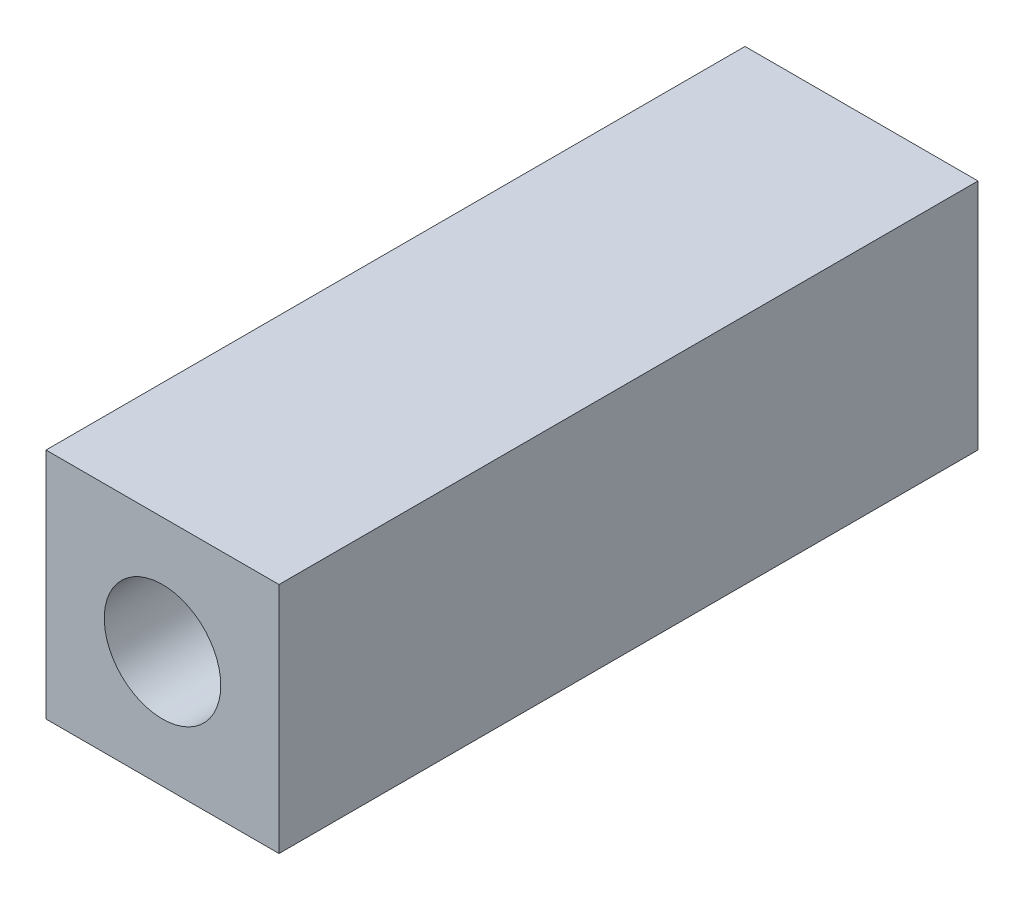
ISO-10303-21;
HEADER;
FILE_DESCRIPTION(('STEP AP214'),'2;1');
FILE_NAME('part.step','',(''),(''),'','','');
FILE_SCHEMA(('AUTOMOTIVE_DESIGN { 1 0 10303 214 1 1 1 1 }'));
ENDSEC;
DATA;
#1=APPLICATION_CONTEXT('core data for automotive mechanical design processes');
#2=APPLICATION_PROTOCOL_DEFINITION('international standard','automotive_design',2000,#1);
#3=PRODUCT_CONTEXT('',#1,'mechanical');
#4=PRODUCT('Part','Part','',(#3));
#5=PRODUCT_RELATED_PRODUCT_CATEGORY('part','',(#4));
#6=PRODUCT_DEFINITION_FORMATION('','',#4);
#7=PRODUCT_DEFINITION_CONTEXT('part definition',#1,'design');
#8=PRODUCT_DEFINITION('design','',#6,#7);
#9=PRODUCT_DEFINITION_SHAPE('','',#8);
#10=(LENGTH_UNIT() NAMED_UNIT(*) SI_UNIT(.MILLI.,.METRE.));
#11=(NAMED_UNIT(*) PLANE_ANGLE_UNIT() SI_UNIT($,.RADIAN.));
#12=(NAMED_UNIT(*) SI_UNIT($,.STERADIAN.) SOLID_ANGLE_UNIT());
#13=UNCERTAINTY_MEASURE_WITH_UNIT(LENGTH_MEASURE(1.E-05),#10,'distance_accuracy_value','');
#14=(GEOMETRIC_REPRESENTATION_CONTEXT(3) GLOBAL_UNCERTAINTY_ASSIGNED_CONTEXT((#13)) GLOBAL_UNIT_ASSIGNED_CONTEXT((#10,
#11,#12)) REPRESENTATION_CONTEXT('',''));
#15=CARTESIAN_POINT('',(0.,0.,0.));
#16=DIRECTION('',(0.,0.,1.));
#17=DIRECTION('',(1.,0.,0.));
#18=AXIS2_PLACEMENT_3D('',#15,#16,#17);
#19=CARTESIAN_POINT('',(0.,0.,30.));
#20=DIRECTION('',(0.,0.,-1.));
#21=DIRECTION('',(-1.,0.,0.));
#22=AXIS2_PLACEMENT_3D('',#19,#20,#21);
#23=PLANE('',#22);
#24=DIRECTION('',(0.,1.,0.));
#25=VECTOR('',#24,1.);
#26=CARTESIAN_POINT('',(5.,-5.,30.));
#27=LINE('',#26,#25);
#28=CARTESIAN_POINT('',(5.,-5.,30.));
#29=VERTEX_POINT('',#28);
#30=CARTESIAN_POINT('',(5.,5.,30.));
#31=VERTEX_POINT('',#30);
#32=EDGE_CURVE('E85',#29,#31,#27,.T.);
#33=ORIENTED_EDGE('',*,*,#32,.T.);
#34=DIRECTION('',(-1.,0.,0.));
#35=VECTOR('',#34,1.);
#36=CARTESIAN_POINT('',(-5.,5.,30.));
#37=LINE('',#36,#35);
#38=CARTESIAN_POINT('',(-5.,5.,30.));
#39=VERTEX_POINT('',#38);
#40=EDGE_CURVE('E80',#31,#39,#37,.T.);
#41=ORIENTED_EDGE('',*,*,#40,.T.);
#42=DIRECTION('',(0.,-1.,0.));
#43=VECTOR('',#42,1.);
#44=CARTESIAN_POINT('',(-5.,-5.,30.));
#45=LINE('',#44,#43);
#46=CARTESIAN_POINT('',(-5.,-5.,30.));
#47=VERTEX_POINT('',#46);
#48=EDGE_CURVE('E83',#39,#47,#45,.T.);
#49=ORIENTED_EDGE('',*,*,#48,.T.);
#50=DIRECTION('',(1.,0.,0.));
#51=VECTOR('',#50,1.);
#52=CARTESIAN_POINT('',(-5.,-5.,30.));
#53=LINE('',#52,#51);
#54=EDGE_CURVE('E50',#47,#29,#53,.T.);
#55=ORIENTED_EDGE('',*,*,#54,.T.);
#56=EDGE_LOOP('',(#33,#41,#49,#55));
#57=FACE_BOUND('',#56,.T.);
#58=CARTESIAN_POINT('',(0.,0.,30.));
#59=DIRECTION('',(0.,0.,1.));
#60=DIRECTION('',(1.,0.,0.));
#61=AXIS2_PLACEMENT_3D('',#58,#59,#60);
#62=CIRCLE('',#61,2.5);
#63=CARTESIAN_POINT('',(2.5,0.,30.));
#64=VERTEX_POINT('',#63);
#65=EDGE_CURVE('E100',#64,#64,#62,.T.);
#66=ORIENTED_EDGE('',*,*,#65,.F.);
#67=EDGE_LOOP('',(#66));
#68=FACE_BOUND('',#67,.T.);
#69=ADVANCED_FACE('F33',(#57,#68),#23,.F.);
#70=CARTESIAN_POINT('',(0.,0.,0.));
#71=DIRECTION('',(0.,0.,-1.));
#72=DIRECTION('',(-1.,0.,0.));
#73=AXIS2_PLACEMENT_3D('',#70,#71,#72);
#74=PLANE('',#73);
#75=DIRECTION('',(0.,1.,0.));
#76=VECTOR('',#75,1.);
#77=CARTESIAN_POINT('',(5.,-5.,0.));
#78=LINE('',#77,#76);
#79=CARTESIAN_POINT('',(5.,-5.,0.));
#80=VERTEX_POINT('',#79);
#81=CARTESIAN_POINT('',(5.,5.,0.));
#82=VERTEX_POINT('',#81);
#83=EDGE_CURVE('E97',#80,#82,#78,.T.);
#84=ORIENTED_EDGE('',*,*,#83,.F.);
#85=DIRECTION('',(1.,0.,0.));
#86=VECTOR('',#85,1.);
#87=CARTESIAN_POINT('',(-5.,-5.,0.));
#88=LINE('',#87,#86);
#89=CARTESIAN_POINT('',(-5.,-5.,0.));
#90=VERTEX_POINT('',#89);
#91=EDGE_CURVE('E73',#90,#80,#88,.T.);
#92=ORIENTED_EDGE('',*,*,#91,.F.);
#93=DIRECTION('',(0.,-1.,0.));
#94=VECTOR('',#93,1.);
#95=CARTESIAN_POINT('',(-5.,-5.,0.));
#96=LINE('',#95,#94);
#97=CARTESIAN_POINT('',(-5.,5.,0.));
#98=VERTEX_POINT('',#97);
#99=EDGE_CURVE('E67',#98,#90,#96,.T.);
#100=ORIENTED_EDGE('',*,*,#99,.F.);
#101=DIRECTION('',(-1.,0.,0.));
#102=VECTOR('',#101,1.);
#103=CARTESIAN_POINT('',(-5.,5.,0.));
#104=LINE('',#103,#102);
#105=EDGE_CURVE('E89',#82,#98,#104,.T.);
#106=ORIENTED_EDGE('',*,*,#105,.F.);
#107=EDGE_LOOP('',(#84,#92,#100,#106));
#108=FACE_BOUND('',#107,.T.);
#109=CARTESIAN_POINT('',(0.,0.,0.));
#110=DIRECTION('',(0.,0.,1.));
#111=DIRECTION('',(1.,0.,0.));
#112=AXIS2_PLACEMENT_3D('',#109,#110,#111);
#113=CIRCLE('',#112,2.5);
#114=CARTESIAN_POINT('',(2.5,0.,0.));
#115=VERTEX_POINT('',#114);
#116=EDGE_CURVE('E112',#115,#115,#113,.T.);
#117=ORIENTED_EDGE('',*,*,#116,.T.);
#118=EDGE_LOOP('',(#117));
#119=FACE_BOUND('',#118,.T.);
#120=ADVANCED_FACE('F108',(#108,#119),#74,.T.);
#121=CARTESIAN_POINT('',(5.,-5.,30.));
#122=DIRECTION('',(-1.,0.,0.));
#123=DIRECTION('',(0.,0.,1.));
#124=AXIS2_PLACEMENT_3D('',#121,#122,#123);
#125=PLANE('',#124);
#126=ORIENTED_EDGE('',*,*,#83,.T.);
#127=DIRECTION('',(0.,0.,-1.));
#128=VECTOR('',#127,1.);
#129=CARTESIAN_POINT('',(5.,5.,30.));
#130=LINE('',#129,#128);
#131=EDGE_CURVE('E11',#31,#82,#130,.T.);
#132=ORIENTED_EDGE('',*,*,#131,.F.);
#133=ORIENTED_EDGE('',*,*,#32,.F.);
#134=DIRECTION('',(0.,0.,-1.));
#135=VECTOR('',#134,1.);
#136=CARTESIAN_POINT('',(5.,-5.,30.));
#137=LINE('',#136,#135);
#138=EDGE_CURVE('E93',#29,#80,#137,.T.);
#139=ORIENTED_EDGE('',*,*,#138,.T.);
#140=EDGE_LOOP('',(#126,#132,#133,#139));
#141=FACE_BOUND('',#140,.T.);
#142=ADVANCED_FACE('F35',(#141),#125,.F.);
#143=CARTESIAN_POINT('',(-5.,5.,30.));
#144=DIRECTION('',(0.,-1.,0.));
#145=DIRECTION('',(0.,0.,-1.));
#146=AXIS2_PLACEMENT_3D('',#143,#144,#145);
#147=PLANE('',#146);
#148=ORIENTED_EDGE('',*,*,#105,.T.);
#149=DIRECTION('',(0.,0.,-1.));
#150=VECTOR('',#149,1.);
#151=CARTESIAN_POINT('',(-5.,5.,30.));
#152=LINE('',#151,#150);
#153=EDGE_CURVE('E42',#39,#98,#152,.T.);
#154=ORIENTED_EDGE('',*,*,#153,.F.);
#155=ORIENTED_EDGE('',*,*,#40,.F.);
#156=ORIENTED_EDGE('',*,*,#131,.T.);
#157=EDGE_LOOP('',(#148,#154,#155,#156));
#158=FACE_BOUND('',#157,.T.);
#159=ADVANCED_FACE('F88',(#158),#147,.F.);
#160=CARTESIAN_POINT('',(-5.,-5.,30.));
#161=DIRECTION('',(1.,0.,0.));
#162=DIRECTION('',(0.,0.,-1.));
#163=AXIS2_PLACEMENT_3D('',#160,#161,#162);
#164=PLANE('',#163);
#165=ORIENTED_EDGE('',*,*,#99,.T.);
#166=DIRECTION('',(0.,0.,-1.));
#167=VECTOR('',#166,1.);
#168=CARTESIAN_POINT('',(-5.,-5.,30.));
#169=LINE('',#168,#167);
#170=EDGE_CURVE('E90',#47,#90,#169,.T.);
#171=ORIENTED_EDGE('',*,*,#170,.F.);
#172=ORIENTED_EDGE('',*,*,#48,.F.);
#173=ORIENTED_EDGE('',*,*,#153,.T.);
#174=EDGE_LOOP('',(#165,#171,#172,#173));
#175=FACE_BOUND('',#174,.T.);
#176=ADVANCED_FACE('F91',(#175),#164,.F.);
#177=CARTESIAN_POINT('',(-5.,-5.,30.));
#178=DIRECTION('',(0.,1.,0.));
#179=DIRECTION('',(0.,0.,1.));
#180=AXIS2_PLACEMENT_3D('',#177,#178,#179);
#181=PLANE('',#180);
#182=ORIENTED_EDGE('',*,*,#91,.T.);
#183=ORIENTED_EDGE('',*,*,#138,.F.);
#184=ORIENTED_EDGE('',*,*,#54,.F.);
#185=ORIENTED_EDGE('',*,*,#170,.T.);
#186=EDGE_LOOP('',(#182,#183,#184,#185));
#187=FACE_BOUND('',#186,.T.);
#188=ADVANCED_FACE('F105',(#187),#181,.F.);
#189=CARTESIAN_POINT('',(0.,0.,30.));
#190=DIRECTION('',(0.,0.,-1.));
#191=DIRECTION('',(-1.,0.,0.));
#192=AXIS2_PLACEMENT_3D('',#189,#190,#191);
#193=CYLINDRICAL_SURFACE('',#192,2.5);
#194=ORIENTED_EDGE('',*,*,#65,.T.);
#195=EDGE_LOOP('',(#194));
#196=FACE_BOUND('',#195,.T.);
#197=ORIENTED_EDGE('',*,*,#116,.F.);
#198=EDGE_LOOP('',(#197));
#199=FACE_BOUND('',#198,.T.);
#200=ADVANCED_FACE('F118',(#196,#199),#193,.F.);
#201=CLOSED_SHELL('',(#69,#120,#142,#159,#176,#188,#200));
#202=MANIFOLD_SOLID_BREP('B2',#201);
#203=ADVANCED_BREP_SHAPE_REPRESENTATION('',(#18,#202),#14);
#204=SHAPE_DEFINITION_REPRESENTATION(#9,#203);
ENDSEC;
END-ISO-10303-21;
